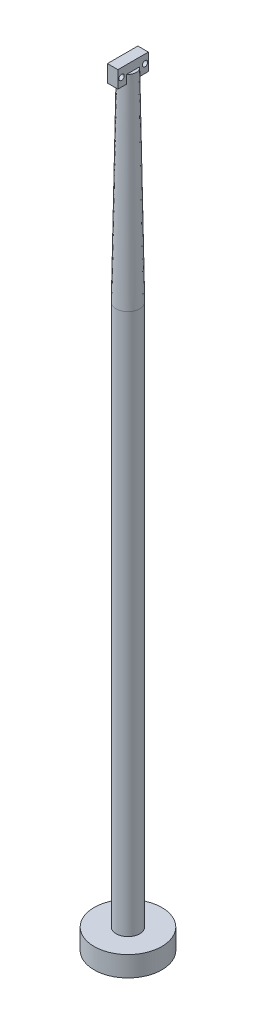
ISO-10303-21;
HEADER;
FILE_DESCRIPTION(('STEP AP214'),'2;1');
FILE_NAME('part.step','',(''),(''),'','','');
FILE_SCHEMA(('AUTOMOTIVE_DESIGN { 1 0 10303 214 1 1 1 1 }'));
ENDSEC;
DATA;
#1=APPLICATION_CONTEXT('core data for automotive mechanical design processes');
#2=APPLICATION_PROTOCOL_DEFINITION('international standard','automotive_design',2000,#1);
#3=PRODUCT_CONTEXT('',#1,'mechanical');
#4=PRODUCT('Part','Part','',(#3));
#5=PRODUCT_RELATED_PRODUCT_CATEGORY('part','',(#4));
#6=PRODUCT_DEFINITION_FORMATION('','',#4);
#7=PRODUCT_DEFINITION_CONTEXT('part definition',#1,'design');
#8=PRODUCT_DEFINITION('design','',#6,#7);
#9=PRODUCT_DEFINITION_SHAPE('','',#8);
#10=(LENGTH_UNIT() NAMED_UNIT(*) SI_UNIT(.MILLI.,.METRE.));
#11=(NAMED_UNIT(*) PLANE_ANGLE_UNIT() SI_UNIT($,.RADIAN.));
#12=(NAMED_UNIT(*) SI_UNIT($,.STERADIAN.) SOLID_ANGLE_UNIT());
#13=UNCERTAINTY_MEASURE_WITH_UNIT(LENGTH_MEASURE(1.E-05),#10,'distance_accuracy_value','');
#14=(GEOMETRIC_REPRESENTATION_CONTEXT(3) GLOBAL_UNCERTAINTY_ASSIGNED_CONTEXT((#13)) GLOBAL_UNIT_ASSIGNED_CONTEXT((#10,
#11,#12)) REPRESENTATION_CONTEXT('',''));
#15=CARTESIAN_POINT('',(0.,0.,0.));
#16=DIRECTION('',(0.,0.,1.));
#17=DIRECTION('',(1.,0.,0.));
#18=AXIS2_PLACEMENT_3D('',#15,#16,#17);
#19=CARTESIAN_POINT('',(0.,11300.,0.));
#20=DIRECTION('',(0.,1.,0.));
#21=DIRECTION('',(0.,0.,1.));
#22=AXIS2_PLACEMENT_3D('',#19,#20,#21);
#23=PLANE('',#22);
#24=CARTESIAN_POINT('',(0.,11300.,0.));
#25=DIRECTION('',(0.,1.,0.));
#26=DIRECTION('',(0.,0.,1.));
#27=AXIS2_PLACEMENT_3D('',#24,#25,#26);
#28=CIRCLE('',#27,122.634805215347);
#29=CARTESIAN_POINT('',(-79.,11300.,-93.7992294755459));
#30=VERTEX_POINT('',#29);
#31=CARTESIAN_POINT('',(-79.,11300.,93.7992294755459));
#32=VERTEX_POINT('',#31);
#33=EDGE_CURVE('E199',#30,#32,#28,.T.);
#34=ORIENTED_EDGE('',*,*,#33,.T.);
#35=DIRECTION('',(0.,0.,-1.));
#36=VECTOR('',#35,1.);
#37=CARTESIAN_POINT('',(-79.,11300.,0.));
#38=LINE('',#37,#36);
#39=EDGE_CURVE('E213',#32,#30,#38,.T.);
#40=ORIENTED_EDGE('',*,*,#39,.T.);
#41=EDGE_LOOP('',(#34,#40));
#42=FACE_BOUND('',#41,.T.);
#43=ADVANCED_FACE('F33',(#42),#23,.T.);
#44=CARTESIAN_POINT('',(0.,300.,0.));
#45=DIRECTION('',(0.,-1.,0.));
#46=DIRECTION('',(0.,0.,-1.));
#47=AXIS2_PLACEMENT_3D('',#44,#45,#46);
#48=CYLINDRICAL_SURFACE('',#47,500.);
#49=CARTESIAN_POINT('',(0.,300.,0.));
#50=DIRECTION('',(0.,1.,0.));
#51=DIRECTION('',(0.,0.,1.));
#52=AXIS2_PLACEMENT_3D('',#49,#50,#51);
#53=CIRCLE('',#52,500.);
#54=CARTESIAN_POINT('',(0.,300.,500.));
#55=VERTEX_POINT('',#54);
#56=EDGE_CURVE('E210',#55,#55,#53,.T.);
#57=ORIENTED_EDGE('',*,*,#56,.F.);
#58=EDGE_LOOP('',(#57));
#59=FACE_BOUND('',#58,.T.);
#60=CARTESIAN_POINT('',(0.,0.,0.));
#61=DIRECTION('',(0.,1.,0.));
#62=DIRECTION('',(0.,0.,1.));
#63=AXIS2_PLACEMENT_3D('',#60,#61,#62);
#64=CIRCLE('',#63,500.);
#65=CARTESIAN_POINT('',(0.,0.,500.));
#66=VERTEX_POINT('',#65);
#67=EDGE_CURVE('E207',#66,#66,#64,.T.);
#68=ORIENTED_EDGE('',*,*,#67,.T.);
#69=EDGE_LOOP('',(#68));
#70=FACE_BOUND('',#69,.T.);
#71=ADVANCED_FACE('F35',(#59,#70),#48,.T.);
#72=CARTESIAN_POINT('',(0.,300.,0.));
#73=DIRECTION('',(0.,1.,0.));
#74=DIRECTION('',(0.,0.,1.));
#75=AXIS2_PLACEMENT_3D('',#72,#73,#74);
#76=PLANE('',#75);
#77=CARTESIAN_POINT('',(0.,300.,0.));
#78=DIRECTION('',(0.,1.,0.));
#79=DIRECTION('',(0.,0.,1.));
#80=AXIS2_PLACEMENT_3D('',#77,#78,#79);
#81=CIRCLE('',#80,175.);
#82=CARTESIAN_POINT('',(0.,300.,175.));
#83=VERTEX_POINT('',#82);
#84=EDGE_CURVE('E203',#83,#83,#81,.T.);
#85=ORIENTED_EDGE('',*,*,#84,.F.);
#86=EDGE_LOOP('',(#85));
#87=FACE_BOUND('',#86,.T.);
#88=ORIENTED_EDGE('',*,*,#56,.T.);
#89=EDGE_LOOP('',(#88));
#90=FACE_BOUND('',#89,.T.);
#91=ADVANCED_FACE('F242',(#87,#90),#76,.T.);
#92=CARTESIAN_POINT('',(0.,0.,0.));
#93=DIRECTION('',(0.,1.,0.));
#94=DIRECTION('',(0.,0.,1.));
#95=AXIS2_PLACEMENT_3D('',#92,#93,#94);
#96=PLANE('',#95);
#97=ORIENTED_EDGE('',*,*,#67,.F.);
#98=EDGE_LOOP('',(#97));
#99=FACE_BOUND('',#98,.T.);
#100=ADVANCED_FACE('F256',(#99),#96,.F.);
#101=CARTESIAN_POINT('',(0.,8300.,0.));
#102=DIRECTION('',(0.,-1.,0.));
#103=DIRECTION('',(0.,0.,-1.));
#104=AXIS2_PLACEMENT_3D('',#101,#102,#103);
#105=CYLINDRICAL_SURFACE('',#104,175.);
#106=CARTESIAN_POINT('',(0.,8300.,0.));
#107=DIRECTION('',(0.,1.,0.));
#108=DIRECTION('',(0.,0.,1.));
#109=AXIS2_PLACEMENT_3D('',#106,#107,#108);
#110=CIRCLE('',#109,175.);
#111=CARTESIAN_POINT('',(0.,8300.,175.));
#112=VERTEX_POINT('',#111);
#113=EDGE_CURVE('E204',#112,#112,#110,.T.);
#114=ORIENTED_EDGE('',*,*,#113,.F.);
#115=EDGE_LOOP('',(#114));
#116=FACE_BOUND('',#115,.T.);
#117=ORIENTED_EDGE('',*,*,#84,.T.);
#118=EDGE_LOOP('',(#117));
#119=FACE_BOUND('',#118,.T.);
#120=ADVANCED_FACE('F252',(#116,#119),#105,.T.);
#121=CARTESIAN_POINT('',(0.,8300.,0.));
#122=DIRECTION('',(0.,-1.,0.));
#123=DIRECTION('',(0.,0.,1.));
#124=AXIS2_PLACEMENT_3D('',#121,#122,#123);
#125=CONICAL_SURFACE('',#124,175.,0.0174532925199434);
#126=CARTESIAN_POINT('',(0.,11175.,0.));
#127=DIRECTION('',(0.,-1.,0.));
#128=DIRECTION('',(0.,0.,-1.));
#129=AXIS2_PLACEMENT_3D('',#126,#127,#128);
#130=CIRCLE('',#129,124.816688331374);
#131=CARTESIAN_POINT('',(-79.,11175.,-96.6343918385797));
#132=VERTEX_POINT('',#131);
#133=CARTESIAN_POINT('',(76.,11175.,-99.0111392016605));
#134=VERTEX_POINT('',#133);
#135=EDGE_CURVE('E11',#132,#134,#130,.T.);
#136=ORIENTED_EDGE('',*,*,#135,.T.);
#137=CARTESIAN_POINT('',(76.,10961.3450010045,-103.672981170937));
#138=CARTESIAN_POINT('',(76.,11002.0524482871,-102.791943214282));
#139=CARTESIAN_POINT('',(76.,11042.7598113228,-101.907006159478));
#140=CARTESIAN_POINT('',(76.,11124.1743498459,-100.128642942186));
#141=CARTESIAN_POINT('',(76.,11164.8815253334,-99.2352167801339));
#142=CARTESIAN_POINT('',(76.,11246.295674207,-97.439184339552));
#143=CARTESIAN_POINT('',(76.,11287.002647593,-96.536578060951));
#144=CARTESIAN_POINT('',(76.,11368.4163732934,-94.7213578878458));
#145=CARTESIAN_POINT('',(76.,11409.1231256078,-93.8087439928269));
#146=CARTESIAN_POINT('',(76.,11449.8297559654,-92.8907125828367));
#147=B_SPLINE_CURVE_WITH_KNOTS('',3,(#137,#138,#139,#140,#141,#142,#143,#144,#145,#146),
.UNSPECIFIED.,.F.,.F.,(4,2,2,2,4),(0.,122.150941188795,244.301876097274,366.452811951517,
488.603754087766),.UNSPECIFIED.);
#148=CARTESIAN_POINT('',(76.,11300.,-96.2460152432615));
#149=VERTEX_POINT('',#148);
#150=EDGE_CURVE('E194',#134,#149,#147,.T.);
#151=ORIENTED_EDGE('',*,*,#150,.T.);
#152=CARTESIAN_POINT('',(76.,11300.,96.2460152432615));
#153=VERTEX_POINT('',#152);
#154=EDGE_CURVE('E200',#153,#149,#28,.T.);
#155=ORIENTED_EDGE('',*,*,#154,.F.);
#156=CARTESIAN_POINT('',(76.,11449.8297559654,92.8907125828367));
#157=CARTESIAN_POINT('',(76.,11409.1231256078,93.8087439928269));
#158=CARTESIAN_POINT('',(76.,11368.4163732934,94.7213578878458));
#159=CARTESIAN_POINT('',(76.,11287.002647593,96.5365780609509));
#160=CARTESIAN_POINT('',(76.,11246.295674207,97.4391843395519));
#161=CARTESIAN_POINT('',(76.,11164.8815253334,99.2352167801339));
#162=CARTESIAN_POINT('',(76.,11124.1743498459,100.128642942186));
#163=CARTESIAN_POINT('',(76.,11042.7598113228,101.907006159478));
#164=CARTESIAN_POINT('',(76.,11002.0524482871,102.791943214282));
#165=CARTESIAN_POINT('',(76.,10961.3450010045,103.672981170937));
#166=B_SPLINE_CURVE_WITH_KNOTS('',3,(#156,#157,#158,#159,#160,#161,#162,#163,#164,#165),
.UNSPECIFIED.,.F.,.F.,(4,2,2,2,4),(0.,122.150942136249,244.30187799049,366.452812898971,
488.603754087766),.UNSPECIFIED.);
#167=CARTESIAN_POINT('',(76.,11175.,99.0111392016606));
#168=VERTEX_POINT('',#167);
#169=EDGE_CURVE('E189',#153,#168,#166,.T.);
#170=ORIENTED_EDGE('',*,*,#169,.T.);
#171=CARTESIAN_POINT('',(-79.,11175.,96.6343918385797));
#172=VERTEX_POINT('',#171);
#173=EDGE_CURVE('E37',#168,#172,#130,.T.);
#174=ORIENTED_EDGE('',*,*,#173,.T.);
#175=CARTESIAN_POINT('',(-79.,11449.773776938,90.3544079248871));
#176=CARTESIAN_POINT('',(-79.,11409.0674225103,91.2982052061098));
#177=CARTESIAN_POINT('',(-79.,11368.3609210498,92.2356471863578));
#178=CARTESIAN_POINT('',(-79.,11286.9476532916,94.0988370728721));
#179=CARTESIAN_POINT('',(-79.,11246.2408869938,95.0245849799531));
#180=CARTESIAN_POINT('',(-79.,11164.8271135668,96.8654033691673));
#181=CARTESIAN_POINT('',(-79.,11124.1201064375,97.7804738514183));
#182=CARTESIAN_POINT('',(-79.,11042.7058693609,99.6007775038031));
#183=CARTESIAN_POINT('',(-79.,11001.9986394135,100.506010673252));
#184=CARTESIAN_POINT('',(-79.,10961.291310123,101.406745173891));
#185=B_SPLINE_CURVE_WITH_KNOTS('',3,(#175,#176,#177,#178,#179,#180,#181,#182,#183,#184),
.UNSPECIFIED.,.F.,.F.,(4,2,2,2,4),(0.,122.151881539936,244.303754570798,366.455626255967,
488.607506447586),.UNSPECIFIED.);
#186=EDGE_CURVE('E148',#32,#172,#185,.T.);
#187=ORIENTED_EDGE('',*,*,#186,.F.);
#188=ORIENTED_EDGE('',*,*,#33,.F.);
#189=CARTESIAN_POINT('',(-79.,10961.291310123,-101.406745173891));
#190=CARTESIAN_POINT('',(-79.,11001.9986394135,-100.506010673252));
#191=CARTESIAN_POINT('',(-79.,11042.7058693609,-99.6007775038031));
#192=CARTESIAN_POINT('',(-79.,11124.1201064375,-97.7804738514182));
#193=CARTESIAN_POINT('',(-79.,11164.8271135668,-96.8654033691673));
#194=CARTESIAN_POINT('',(-79.,11246.2408869938,-95.024584979953));
#195=CARTESIAN_POINT('',(-79.,11286.9476532916,-94.0988370728721));
#196=CARTESIAN_POINT('',(-79.,11368.3609210498,-92.2356471863578));
#197=CARTESIAN_POINT('',(-79.,11409.0674225103,-91.2982052061098));
#198=CARTESIAN_POINT('',(-79.,11449.773776938,-90.3544079248871));
#199=B_SPLINE_CURVE_WITH_KNOTS('',3,(#189,#190,#191,#192,#193,#194,#195,#196,#197,#198),
.UNSPECIFIED.,.F.,.F.,(4,2,2,2,4),(0.,122.151880191622,244.30375187679,366.45562490765,
488.607506447586),.UNSPECIFIED.);
#200=EDGE_CURVE('E48',#132,#30,#199,.T.);
#201=ORIENTED_EDGE('',*,*,#200,.F.);
#202=EDGE_LOOP('',(#136,#151,#155,#170,#174,#187,#188,#201));
#203=FACE_BOUND('',#202,.T.);
#204=ORIENTED_EDGE('',*,*,#113,.T.);
#205=EDGE_LOOP('',(#204));
#206=FACE_BOUND('',#205,.T.);
#207=ADVANCED_FACE('F163',(#203,#206),#125,.T.);
#208=DIRECTION('',(0.,0.,-1.));
#209=VECTOR('',#208,1.);
#210=CARTESIAN_POINT('',(76.,11300.,0.));
#211=LINE('',#210,#209);
#212=EDGE_CURVE('E56',#153,#149,#211,.T.);
#213=ORIENTED_EDGE('',*,*,#212,.F.);
#214=ORIENTED_EDGE('',*,*,#154,.T.);
#215=EDGE_LOOP('',(#213,#214));
#216=FACE_BOUND('',#215,.T.);
#217=ADVANCED_FACE('F236',(#216),#23,.T.);
#218=CARTESIAN_POINT('',(76.,11175.,225.000000000001));
#219=DIRECTION('',(0.,-1.,0.));
#220=DIRECTION('',(0.,0.,-1.));
#221=AXIS2_PLACEMENT_3D('',#218,#219,#220);
#222=PLANE('',#221);
#223=ORIENTED_EDGE('',*,*,#173,.F.);
#224=DIRECTION('',(0.,0.,1.));
#225=VECTOR('',#224,1.);
#226=CARTESIAN_POINT('',(76.,11175.,225.000000000001));
#227=LINE('',#226,#225);
#228=CARTESIAN_POINT('',(76.,11175.,225.000000000001));
#229=VERTEX_POINT('',#228);
#230=EDGE_CURVE('E138',#168,#229,#227,.T.);
#231=ORIENTED_EDGE('',*,*,#230,.T.);
#232=DIRECTION('',(-1.,0.,0.));
#233=VECTOR('',#232,1.);
#234=CARTESIAN_POINT('',(76.,11175.,225.000000000001));
#235=LINE('',#234,#233);
#236=CARTESIAN_POINT('',(-79.,11175.,225.000000000001));
#237=VERTEX_POINT('',#236);
#238=EDGE_CURVE('E109',#229,#237,#235,.T.);
#239=ORIENTED_EDGE('',*,*,#238,.T.);
#240=DIRECTION('',(0.,0.,1.));
#241=VECTOR('',#240,1.);
#242=CARTESIAN_POINT('',(-79.,11175.,225.000000000001));
#243=LINE('',#242,#241);
#244=EDGE_CURVE('E115',#172,#237,#243,.T.);
#245=ORIENTED_EDGE('',*,*,#244,.F.);
#246=EDGE_LOOP('',(#223,#231,#239,#245));
#247=FACE_BOUND('',#246,.T.);
#248=ADVANCED_FACE('F184',(#247),#222,.T.);
#249=CARTESIAN_POINT('',(76.,0.,0.));
#250=DIRECTION('',(1.,0.,0.));
#251=DIRECTION('',(0.,0.,-1.));
#252=AXIS2_PLACEMENT_3D('',#249,#250,#251);
#253=PLANE('',#252);
#254=CARTESIAN_POINT('',(76.,11300.,-176.005281437028));
#255=DIRECTION('',(-1.,0.,0.));
#256=DIRECTION('',(0.,0.,1.));
#257=AXIS2_PLACEMENT_3D('',#254,#255,#256);
#258=CIRCLE('',#257,40.);
#259=CARTESIAN_POINT('',(76.,11300.,-136.005281437028));
#260=VERTEX_POINT('',#259);
#261=EDGE_CURVE('E134',#260,#260,#258,.T.);
#262=ORIENTED_EDGE('',*,*,#261,.T.);
#263=EDGE_LOOP('',(#262));
#264=FACE_BOUND('',#263,.T.);
#265=CARTESIAN_POINT('',(76.,11300.,171.372862680371));
#266=DIRECTION('',(-1.,0.,0.));
#267=DIRECTION('',(0.,0.,1.));
#268=AXIS2_PLACEMENT_3D('',#265,#266,#267);
#269=CIRCLE('',#268,40.);
#270=CARTESIAN_POINT('',(76.,11300.,211.372862680371));
#271=VERTEX_POINT('',#270);
#272=EDGE_CURVE('E131',#271,#271,#269,.T.);
#273=ORIENTED_EDGE('',*,*,#272,.T.);
#274=EDGE_LOOP('',(#273));
#275=FACE_BOUND('',#274,.T.);
#276=ORIENTED_EDGE('',*,*,#150,.F.);
#277=CARTESIAN_POINT('',(76.,11175.,-224.999999999999));
#278=VERTEX_POINT('',#277);
#279=EDGE_CURVE('E139',#278,#134,#227,.T.);
#280=ORIENTED_EDGE('',*,*,#279,.F.);
#281=DIRECTION('',(0.,-1.,0.));
#282=VECTOR('',#281,1.);
#283=CARTESIAN_POINT('',(76.,11425.,-224.999999999999));
#284=LINE('',#283,#282);
#285=CARTESIAN_POINT('',(76.,11425.,-224.999999999999));
#286=VERTEX_POINT('',#285);
#287=EDGE_CURVE('E105',#286,#278,#284,.T.);
#288=ORIENTED_EDGE('',*,*,#287,.F.);
#289=DIRECTION('',(0.,0.,-1.));
#290=VECTOR('',#289,1.);
#291=CARTESIAN_POINT('',(76.,11425.,225.000000000001));
#292=LINE('',#291,#290);
#293=CARTESIAN_POINT('',(76.,11425.,225.000000000001));
#294=VERTEX_POINT('',#293);
#295=EDGE_CURVE('E110',#294,#286,#292,.T.);
#296=ORIENTED_EDGE('',*,*,#295,.F.);
#297=DIRECTION('',(0.,1.,0.));
#298=VECTOR('',#297,1.);
#299=CARTESIAN_POINT('',(76.,11425.,225.000000000001));
#300=LINE('',#299,#298);
#301=EDGE_CURVE('E141',#229,#294,#300,.T.);
#302=ORIENTED_EDGE('',*,*,#301,.F.);
#303=ORIENTED_EDGE('',*,*,#230,.F.);
#304=ORIENTED_EDGE('',*,*,#169,.F.);
#305=ORIENTED_EDGE('',*,*,#212,.T.);
#306=EDGE_LOOP('',(#276,#280,#288,#296,#302,#303,#304,#305));
#307=FACE_BOUND('',#306,.T.);
#308=ADVANCED_FACE('F170',(#264,#275,#307),#253,.T.);
#309=CARTESIAN_POINT('',(-79.,0.,0.));
#310=DIRECTION('',(1.,0.,0.));
#311=DIRECTION('',(0.,0.,-1.));
#312=AXIS2_PLACEMENT_3D('',#309,#310,#311);
#313=PLANE('',#312);
#314=CARTESIAN_POINT('',(-79.,11300.,-176.005281437028));
#315=DIRECTION('',(-1.,0.,0.));
#316=DIRECTION('',(0.,0.,1.));
#317=AXIS2_PLACEMENT_3D('',#314,#315,#316);
#318=CIRCLE('',#317,40.);
#319=CARTESIAN_POINT('',(-79.,11300.,-136.005281437028));
#320=VERTEX_POINT('',#319);
#321=EDGE_CURVE('E122',#320,#320,#318,.T.);
#322=ORIENTED_EDGE('',*,*,#321,.F.);
#323=EDGE_LOOP('',(#322));
#324=FACE_BOUND('',#323,.T.);
#325=CARTESIAN_POINT('',(-79.,11300.,171.372862680371));
#326=DIRECTION('',(-1.,0.,0.));
#327=DIRECTION('',(0.,0.,1.));
#328=AXIS2_PLACEMENT_3D('',#325,#326,#327);
#329=CIRCLE('',#328,40.);
#330=CARTESIAN_POINT('',(-79.,11300.,211.372862680371));
#331=VERTEX_POINT('',#330);
#332=EDGE_CURVE('E125',#331,#331,#329,.T.);
#333=ORIENTED_EDGE('',*,*,#332,.F.);
#334=EDGE_LOOP('',(#333));
#335=FACE_BOUND('',#334,.T.);
#336=CARTESIAN_POINT('',(-79.,11175.,-224.999999999999));
#337=VERTEX_POINT('',#336);
#338=EDGE_CURVE('E112',#337,#132,#243,.T.);
#339=ORIENTED_EDGE('',*,*,#338,.T.);
#340=ORIENTED_EDGE('',*,*,#200,.T.);
#341=ORIENTED_EDGE('',*,*,#39,.F.);
#342=ORIENTED_EDGE('',*,*,#186,.T.);
#343=ORIENTED_EDGE('',*,*,#244,.T.);
#344=DIRECTION('',(0.,1.,0.));
#345=VECTOR('',#344,1.);
#346=CARTESIAN_POINT('',(-79.,11425.,225.000000000001));
#347=LINE('',#346,#345);
#348=CARTESIAN_POINT('',(-79.,11425.,225.000000000001));
#349=VERTEX_POINT('',#348);
#350=EDGE_CURVE('E114',#237,#349,#347,.T.);
#351=ORIENTED_EDGE('',*,*,#350,.T.);
#352=DIRECTION('',(0.,0.,-1.));
#353=VECTOR('',#352,1.);
#354=CARTESIAN_POINT('',(-79.,11425.,225.000000000001));
#355=LINE('',#354,#353);
#356=CARTESIAN_POINT('',(-79.,11425.,-224.999999999999));
#357=VERTEX_POINT('',#356);
#358=EDGE_CURVE('E121',#349,#357,#355,.T.);
#359=ORIENTED_EDGE('',*,*,#358,.T.);
#360=DIRECTION('',(0.,-1.,0.));
#361=VECTOR('',#360,1.);
#362=CARTESIAN_POINT('',(-79.,11425.,-224.999999999999));
#363=LINE('',#362,#361);
#364=EDGE_CURVE('E103',#357,#337,#363,.T.);
#365=ORIENTED_EDGE('',*,*,#364,.T.);
#366=EDGE_LOOP('',(#339,#340,#341,#342,#343,#351,#359,#365));
#367=FACE_BOUND('',#366,.T.);
#368=ADVANCED_FACE('F118',(#324,#335,#367),#313,.F.);
#369=CARTESIAN_POINT('',(76.,11425.,-224.999999999999));
#370=DIRECTION('',(0.,0.,-1.));
#371=DIRECTION('',(0.,1.,0.));
#372=AXIS2_PLACEMENT_3D('',#369,#370,#371);
#373=PLANE('',#372);
#374=DIRECTION('',(-1.,0.,0.));
#375=VECTOR('',#374,1.);
#376=CARTESIAN_POINT('',(76.,11175.,-224.999999999999));
#377=LINE('',#376,#375);
#378=EDGE_CURVE('E99',#278,#337,#377,.T.);
#379=ORIENTED_EDGE('',*,*,#378,.T.);
#380=ORIENTED_EDGE('',*,*,#364,.F.);
#381=DIRECTION('',(-1.,0.,0.));
#382=VECTOR('',#381,1.);
#383=CARTESIAN_POINT('',(76.,11425.,-224.999999999999));
#384=LINE('',#383,#382);
#385=EDGE_CURVE('E146',#286,#357,#384,.T.);
#386=ORIENTED_EDGE('',*,*,#385,.F.);
#387=ORIENTED_EDGE('',*,*,#287,.T.);
#388=EDGE_LOOP('',(#379,#380,#386,#387));
#389=FACE_BOUND('',#388,.T.);
#390=ADVANCED_FACE('F101',(#389),#373,.T.);
#391=CARTESIAN_POINT('',(76.,11425.,225.000000000001));
#392=DIRECTION('',(0.,1.,0.));
#393=DIRECTION('',(0.,0.,1.));
#394=AXIS2_PLACEMENT_3D('',#391,#392,#393);
#395=PLANE('',#394);
#396=ORIENTED_EDGE('',*,*,#385,.T.);
#397=ORIENTED_EDGE('',*,*,#358,.F.);
#398=DIRECTION('',(-1.,0.,0.));
#399=VECTOR('',#398,1.);
#400=CARTESIAN_POINT('',(76.,11425.,225.000000000001));
#401=LINE('',#400,#399);
#402=EDGE_CURVE('E149',#294,#349,#401,.T.);
#403=ORIENTED_EDGE('',*,*,#402,.F.);
#404=ORIENTED_EDGE('',*,*,#295,.T.);
#405=EDGE_LOOP('',(#396,#397,#403,#404));
#406=FACE_BOUND('',#405,.T.);
#407=ADVANCED_FACE('F186',(#406),#395,.T.);
#408=CARTESIAN_POINT('',(76.,11425.,225.000000000001));
#409=DIRECTION('',(0.,0.,1.));
#410=DIRECTION('',(0.,-1.,0.));
#411=AXIS2_PLACEMENT_3D('',#408,#409,#410);
#412=PLANE('',#411);
#413=ORIENTED_EDGE('',*,*,#402,.T.);
#414=ORIENTED_EDGE('',*,*,#350,.F.);
#415=ORIENTED_EDGE('',*,*,#238,.F.);
#416=ORIENTED_EDGE('',*,*,#301,.T.);
#417=EDGE_LOOP('',(#413,#414,#415,#416));
#418=FACE_BOUND('',#417,.T.);
#419=ADVANCED_FACE('F231',(#418),#412,.T.);
#420=ORIENTED_EDGE('',*,*,#135,.F.);
#421=ORIENTED_EDGE('',*,*,#338,.F.);
#422=ORIENTED_EDGE('',*,*,#378,.F.);
#423=ORIENTED_EDGE('',*,*,#279,.T.);
#424=EDGE_LOOP('',(#420,#421,#422,#423));
#425=FACE_BOUND('',#424,.T.);
#426=ADVANCED_FACE('F113',(#425),#222,.T.);
#427=CARTESIAN_POINT('',(76.,11300.,-176.005281437028));
#428=DIRECTION('',(-1.,0.,0.));
#429=DIRECTION('',(0.,0.,1.));
#430=AXIS2_PLACEMENT_3D('',#427,#428,#429);
#431=CYLINDRICAL_SURFACE('',#430,40.);
#432=ORIENTED_EDGE('',*,*,#261,.F.);
#433=EDGE_LOOP('',(#432));
#434=FACE_BOUND('',#433,.T.);
#435=ORIENTED_EDGE('',*,*,#321,.T.);
#436=EDGE_LOOP('',(#435));
#437=FACE_BOUND('',#436,.T.);
#438=ADVANCED_FACE('F176',(#434,#437),#431,.F.);
#439=CARTESIAN_POINT('',(76.,11300.,171.372862680371));
#440=DIRECTION('',(-1.,0.,0.));
#441=DIRECTION('',(0.,0.,1.));
#442=AXIS2_PLACEMENT_3D('',#439,#440,#441);
#443=CYLINDRICAL_SURFACE('',#442,40.);
#444=ORIENTED_EDGE('',*,*,#272,.F.);
#445=EDGE_LOOP('',(#444));
#446=FACE_BOUND('',#445,.T.);
#447=ORIENTED_EDGE('',*,*,#332,.T.);
#448=EDGE_LOOP('',(#447));
#449=FACE_BOUND('',#448,.T.);
#450=ADVANCED_FACE('F172',(#446,#449),#443,.F.);
#451=CLOSED_SHELL('',(#43,#71,#91,#100,#120,#207,#217,#248,#308,#368,#390,#407,#419,#426,#438,#450));
#452=MANIFOLD_SOLID_BREP('B2',#451);
#453=ADVANCED_BREP_SHAPE_REPRESENTATION('',(#18,#452),#14);
#454=SHAPE_DEFINITION_REPRESENTATION(#9,#453);
ENDSEC;
END-ISO-10303-21;
